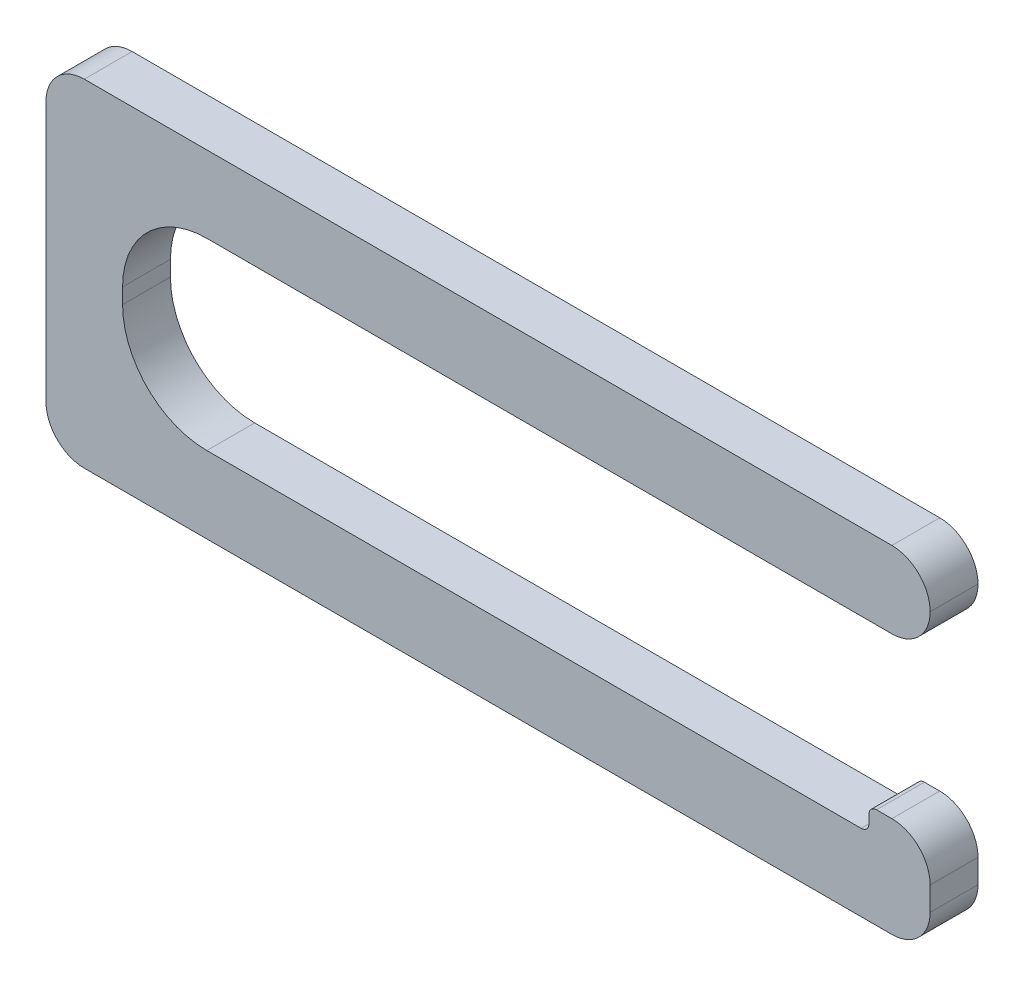
ISO-10303-21;
HEADER;
FILE_DESCRIPTION(('STEP AP214'),'2;1');
FILE_NAME('part.step','',(''),(''),'','','');
FILE_SCHEMA(('AUTOMOTIVE_DESIGN { 1 0 10303 214 1 1 1 1 }'));
ENDSEC;
DATA;
#1=APPLICATION_CONTEXT('core data for automotive mechanical design processes');
#2=APPLICATION_PROTOCOL_DEFINITION('international standard','automotive_design',2000,#1);
#3=PRODUCT_CONTEXT('',#1,'mechanical');
#4=PRODUCT('Part','Part','',(#3));
#5=PRODUCT_RELATED_PRODUCT_CATEGORY('part','',(#4));
#6=PRODUCT_DEFINITION_FORMATION('','',#4);
#7=PRODUCT_DEFINITION_CONTEXT('part definition',#1,'design');
#8=PRODUCT_DEFINITION('design','',#6,#7);
#9=PRODUCT_DEFINITION_SHAPE('','',#8);
#10=(LENGTH_UNIT() NAMED_UNIT(*) SI_UNIT(.MILLI.,.METRE.));
#11=(NAMED_UNIT(*) PLANE_ANGLE_UNIT() SI_UNIT($,.RADIAN.));
#12=(NAMED_UNIT(*) SI_UNIT($,.STERADIAN.) SOLID_ANGLE_UNIT());
#13=UNCERTAINTY_MEASURE_WITH_UNIT(LENGTH_MEASURE(1.E-05),#10,'distance_accuracy_value','');
#14=(GEOMETRIC_REPRESENTATION_CONTEXT(3) GLOBAL_UNCERTAINTY_ASSIGNED_CONTEXT((#13)) GLOBAL_UNIT_ASSIGNED_CONTEXT((#10,
#11,#12)) REPRESENTATION_CONTEXT('',''));
#15=CARTESIAN_POINT('',(0.,0.,0.));
#16=DIRECTION('',(0.,0.,1.));
#17=DIRECTION('',(1.,0.,0.));
#18=AXIS2_PLACEMENT_3D('',#15,#16,#17);
#19=CARTESIAN_POINT('',(5.65188625765606,14.0245622090613,1.5875));
#20=DIRECTION('',(1.,0.,0.));
#21=DIRECTION('',(0.,1.,0.));
#22=AXIS2_PLACEMENT_3D('',#19,#20,#21);
#23=PLANE('',#22);
#24=DIRECTION('',(0.,-1.,0.));
#25=VECTOR('',#24,1.);
#26=CARTESIAN_POINT('',(5.65188625765606,14.0245622090613,0.));
#27=LINE('',#26,#25);
#28=CARTESIAN_POINT('',(5.65188625765606,12.7545622090613,0.));
#29=VERTEX_POINT('',#28);
#30=CARTESIAN_POINT('',(5.65188625765606,4.11856220906129,0.));
#31=VERTEX_POINT('',#30);
#32=EDGE_CURVE('E191',#29,#31,#27,.T.);
#33=ORIENTED_EDGE('',*,*,#32,.T.);
#34=DIRECTION('',(0.,0.,-1.));
#35=VECTOR('',#34,1.);
#36=CARTESIAN_POINT('',(5.65188625765606,4.11856220906129,1.5875));
#37=LINE('',#36,#35);
#38=CARTESIAN_POINT('',(5.65188625765606,4.11856220906129,1.5875));
#39=VERTEX_POINT('',#38);
#40=EDGE_CURVE('E168',#31,#39,#37,.F.);
#41=ORIENTED_EDGE('',*,*,#40,.T.);
#42=DIRECTION('',(0.,-1.,0.));
#43=VECTOR('',#42,1.);
#44=CARTESIAN_POINT('',(5.65188625765606,14.0245622090613,1.5875));
#45=LINE('',#44,#43);
#46=CARTESIAN_POINT('',(5.65188625765606,12.7545622090613,1.5875));
#47=VERTEX_POINT('',#46);
#48=EDGE_CURVE('E216',#47,#39,#45,.T.);
#49=ORIENTED_EDGE('',*,*,#48,.F.);
#50=DIRECTION('',(0.,0.,-1.));
#51=VECTOR('',#50,1.);
#52=CARTESIAN_POINT('',(5.65188625765606,12.7545622090613,1.5875));
#53=LINE('',#52,#51);
#54=EDGE_CURVE('E173',#47,#29,#53,.T.);
#55=ORIENTED_EDGE('',*,*,#54,.T.);
#56=EDGE_LOOP('',(#33,#41,#49,#55));
#57=FACE_BOUND('',#56,.T.);
#58=ADVANCED_FACE('F33',(#57),#23,.F.);
#59=CARTESIAN_POINT('',(5.65188625765606,2.84856220906129,1.5875));
#60=DIRECTION('',(0.,1.,0.));
#61=DIRECTION('',(0.,0.,1.));
#62=AXIS2_PLACEMENT_3D('',#59,#60,#61);
#63=PLANE('',#62);
#64=DIRECTION('',(1.,0.,0.));
#65=VECTOR('',#64,1.);
#66=CARTESIAN_POINT('',(5.65188625765606,2.84856220906129,1.5875));
#67=LINE('',#66,#65);
#68=CARTESIAN_POINT('',(6.92188625765606,2.84856220906129,1.5875));
#69=VERTEX_POINT('',#68);
#70=CARTESIAN_POINT('',(33.7091862576561,2.84856220906129,1.5875));
#71=VERTEX_POINT('',#70);
#72=EDGE_CURVE('E183',#69,#71,#67,.T.);
#73=ORIENTED_EDGE('',*,*,#72,.F.);
#74=DIRECTION('',(0.,0.,-1.));
#75=VECTOR('',#74,1.);
#76=CARTESIAN_POINT('',(6.92188625765606,2.84856220906129,1.5875));
#77=LINE('',#76,#75);
#78=CARTESIAN_POINT('',(6.92188625765606,2.84856220906129,0.));
#79=VERTEX_POINT('',#78);
#80=EDGE_CURVE('E167',#69,#79,#77,.T.);
#81=ORIENTED_EDGE('',*,*,#80,.T.);
#82=DIRECTION('',(1.,0.,0.));
#83=VECTOR('',#82,1.);
#84=CARTESIAN_POINT('',(5.65188625765606,2.84856220906129,0.));
#85=LINE('',#84,#83);
#86=CARTESIAN_POINT('',(33.7091862576561,2.84856220906129,0.));
#87=VERTEX_POINT('',#86);
#88=EDGE_CURVE('E180',#79,#87,#85,.T.);
#89=ORIENTED_EDGE('',*,*,#88,.T.);
#90=DIRECTION('',(0.,0.,-1.));
#91=VECTOR('',#90,1.);
#92=CARTESIAN_POINT('',(33.7091862576561,2.84856220906129,1.5875));
#93=LINE('',#92,#91);
#94=EDGE_CURVE('E185',#87,#71,#93,.F.);
#95=ORIENTED_EDGE('',*,*,#94,.T.);
#96=EDGE_LOOP('',(#73,#81,#89,#95));
#97=FACE_BOUND('',#96,.T.);
#98=ADVANCED_FACE('F179',(#97),#63,.F.);
#99=CARTESIAN_POINT('',(34.9791862576561,2.84856220906129,1.5875));
#100=DIRECTION('',(-1.,0.,0.));
#101=DIRECTION('',(0.,0.,1.));
#102=AXIS2_PLACEMENT_3D('',#99,#100,#101);
#103=PLANE('',#102);
#104=DIRECTION('',(0.,1.,0.));
#105=VECTOR('',#104,1.);
#106=CARTESIAN_POINT('',(34.9791862576561,2.84856220906129,1.5875));
#107=LINE('',#106,#105);
#108=CARTESIAN_POINT('',(34.9791862576561,4.11856220906129,1.5875));
#109=VERTEX_POINT('',#108);
#110=CARTESIAN_POINT('',(34.9791862576561,4.90596220906129,1.5875));
#111=VERTEX_POINT('',#110);
#112=EDGE_CURVE('E315',#109,#111,#107,.T.);
#113=ORIENTED_EDGE('',*,*,#112,.F.);
#114=DIRECTION('',(0.,0.,-1.));
#115=VECTOR('',#114,1.);
#116=CARTESIAN_POINT('',(34.9791862576561,4.11856220906129,1.5875));
#117=LINE('',#116,#115);
#118=CARTESIAN_POINT('',(34.9791862576561,4.11856220906129,0.));
#119=VERTEX_POINT('',#118);
#120=EDGE_CURVE('E245',#109,#119,#117,.T.);
#121=ORIENTED_EDGE('',*,*,#120,.T.);
#122=DIRECTION('',(0.,1.,0.));
#123=VECTOR('',#122,1.);
#124=CARTESIAN_POINT('',(34.9791862576561,2.84856220906129,0.));
#125=LINE('',#124,#123);
#126=CARTESIAN_POINT('',(34.9791862576561,4.90596220906129,0.));
#127=VERTEX_POINT('',#126);
#128=EDGE_CURVE('E190',#119,#127,#125,.T.);
#129=ORIENTED_EDGE('',*,*,#128,.T.);
#130=DIRECTION('',(0.,0.,-1.));
#131=VECTOR('',#130,1.);
#132=CARTESIAN_POINT('',(34.9791862576561,4.90596220906129,1.5875));
#133=LINE('',#132,#131);
#134=EDGE_CURVE('E243',#127,#111,#133,.F.);
#135=ORIENTED_EDGE('',*,*,#134,.T.);
#136=EDGE_LOOP('',(#113,#121,#129,#135));
#137=FACE_BOUND('',#136,.T.);
#138=ADVANCED_FACE('F358',(#137),#103,.F.);
#139=CARTESIAN_POINT('',(32.947186257656,6.17596220906129,1.5875));
#140=DIRECTION('',(0.,-1.,0.));
#141=DIRECTION('',(0.,0.,-1.));
#142=AXIS2_PLACEMENT_3D('',#139,#140,#141);
#143=PLANE('',#142);
#144=DIRECTION('',(-1.,0.,0.));
#145=VECTOR('',#144,1.);
#146=CARTESIAN_POINT('',(32.947186257656,6.17596220906129,0.));
#147=LINE('',#146,#145);
#148=CARTESIAN_POINT('',(33.7091862576561,6.17596220906129,0.));
#149=VERTEX_POINT('',#148);
#150=CARTESIAN_POINT('',(33.201186257656,6.17596220906129,0.));
#151=VERTEX_POINT('',#150);
#152=EDGE_CURVE('E194',#149,#151,#147,.T.);
#153=ORIENTED_EDGE('',*,*,#152,.T.);
#154=DIRECTION('',(0.,0.,-1.));
#155=VECTOR('',#154,1.);
#156=CARTESIAN_POINT('',(33.201186257656,6.17596220906129,1.5875));
#157=LINE('',#156,#155);
#158=CARTESIAN_POINT('',(33.201186257656,6.17596220906129,1.5875));
#159=VERTEX_POINT('',#158);
#160=EDGE_CURVE('E270',#151,#159,#157,.F.);
#161=ORIENTED_EDGE('',*,*,#160,.T.);
#162=DIRECTION('',(-1.,0.,0.));
#163=VECTOR('',#162,1.);
#164=CARTESIAN_POINT('',(32.947186257656,6.17596220906129,1.5875));
#165=LINE('',#164,#163);
#166=CARTESIAN_POINT('',(33.7091862576561,6.17596220906129,1.5875));
#167=VERTEX_POINT('',#166);
#168=EDGE_CURVE('E312',#167,#159,#165,.T.);
#169=ORIENTED_EDGE('',*,*,#168,.F.);
#170=DIRECTION('',(0.,0.,-1.));
#171=VECTOR('',#170,1.);
#172=CARTESIAN_POINT('',(33.7091862576561,6.17596220906129,1.5875));
#173=LINE('',#172,#171);
#174=EDGE_CURVE('E248',#167,#149,#173,.T.);
#175=ORIENTED_EDGE('',*,*,#174,.T.);
#176=EDGE_LOOP('',(#153,#161,#169,#175));
#177=FACE_BOUND('',#176,.T.);
#178=ADVANCED_FACE('F390',(#177),#143,.F.);
#179=CARTESIAN_POINT('',(32.947186257656,5.38856220906129,1.5875));
#180=DIRECTION('',(1.,0.,0.));
#181=DIRECTION('',(0.,0.,-1.));
#182=AXIS2_PLACEMENT_3D('',#179,#180,#181);
#183=PLANE('',#182);
#184=DIRECTION('',(0.,-1.,0.));
#185=VECTOR('',#184,1.);
#186=CARTESIAN_POINT('',(32.947186257656,5.38856220906129,0.));
#187=LINE('',#186,#185);
#188=CARTESIAN_POINT('',(32.947186257656,5.92196220906129,0.));
#189=VERTEX_POINT('',#188);
#190=CARTESIAN_POINT('',(32.947186257656,5.64256220906129,0.));
#191=VERTEX_POINT('',#190);
#192=EDGE_CURVE('E202',#189,#191,#187,.T.);
#193=ORIENTED_EDGE('',*,*,#192,.T.);
#194=DIRECTION('',(0.,0.,-1.));
#195=VECTOR('',#194,1.);
#196=CARTESIAN_POINT('',(32.947186257656,5.64256220906129,1.5875));
#197=LINE('',#196,#195);
#198=CARTESIAN_POINT('',(32.947186257656,5.64256220906129,1.5875));
#199=VERTEX_POINT('',#198);
#200=EDGE_CURVE('E266',#191,#199,#197,.F.);
#201=ORIENTED_EDGE('',*,*,#200,.T.);
#202=DIRECTION('',(0.,-1.,0.));
#203=VECTOR('',#202,1.);
#204=CARTESIAN_POINT('',(32.947186257656,5.38856220906129,1.5875));
#205=LINE('',#204,#203);
#206=CARTESIAN_POINT('',(32.947186257656,5.92196220906129,1.5875));
#207=VERTEX_POINT('',#206);
#208=EDGE_CURVE('E309',#207,#199,#205,.T.);
#209=ORIENTED_EDGE('',*,*,#208,.F.);
#210=DIRECTION('',(0.,0.,-1.));
#211=VECTOR('',#210,1.);
#212=CARTESIAN_POINT('',(32.947186257656,5.92196220906129,1.5875));
#213=LINE('',#212,#211);
#214=EDGE_CURVE('E263',#207,#189,#213,.T.);
#215=ORIENTED_EDGE('',*,*,#214,.T.);
#216=EDGE_LOOP('',(#193,#201,#209,#215));
#217=FACE_BOUND('',#216,.T.);
#218=ADVANCED_FACE('F395',(#217),#183,.F.);
#219=CARTESIAN_POINT('',(32.947186257656,5.38856220906129,1.5875));
#220=DIRECTION('',(0.,-1.,0.));
#221=DIRECTION('',(1.,0.,0.));
#222=AXIS2_PLACEMENT_3D('',#219,#220,#221);
#223=PLANE('',#222);
#224=DIRECTION('',(-1.,0.,0.));
#225=VECTOR('',#224,1.);
#226=CARTESIAN_POINT('',(32.947186257656,5.38856220906129,0.));
#227=LINE('',#226,#225);
#228=CARTESIAN_POINT('',(32.6931862576561,5.38856220906129,0.));
#229=VERTEX_POINT('',#228);
#230=CARTESIAN_POINT('',(10.9858862576561,5.38856220906129,0.));
#231=VERTEX_POINT('',#230);
#232=EDGE_CURVE('E205',#229,#231,#227,.T.);
#233=ORIENTED_EDGE('',*,*,#232,.T.);
#234=DIRECTION('',(0.,0.,-1.));
#235=VECTOR('',#234,1.);
#236=CARTESIAN_POINT('',(10.9858862576561,5.38856220906129,1.5875));
#237=LINE('',#236,#235);
#238=CARTESIAN_POINT('',(10.9858862576561,5.38856220906129,1.5875));
#239=VERTEX_POINT('',#238);
#240=EDGE_CURVE('E283',#231,#239,#237,.F.);
#241=ORIENTED_EDGE('',*,*,#240,.T.);
#242=DIRECTION('',(-1.,0.,0.));
#243=VECTOR('',#242,1.);
#244=CARTESIAN_POINT('',(32.947186257656,5.38856220906129,1.5875));
#245=LINE('',#244,#243);
#246=CARTESIAN_POINT('',(32.6931862576561,5.38856220906129,1.5875));
#247=VERTEX_POINT('',#246);
#248=EDGE_CURVE('E304',#247,#239,#245,.T.);
#249=ORIENTED_EDGE('',*,*,#248,.F.);
#250=DIRECTION('',(0.,0.,-1.));
#251=VECTOR('',#250,1.);
#252=CARTESIAN_POINT('',(32.6931862576561,5.38856220906129,0.));
#253=LINE('',#252,#251);
#254=EDGE_CURVE('E258',#247,#229,#253,.T.);
#255=ORIENTED_EDGE('',*,*,#254,.T.);
#256=EDGE_LOOP('',(#233,#241,#249,#255));
#257=FACE_BOUND('',#256,.T.);
#258=ADVANCED_FACE('F407',(#257),#223,.F.);
#259=CARTESIAN_POINT('',(8.19188625765606,5.38856220906129,1.5875));
#260=DIRECTION('',(-1.,0.,0.));
#261=DIRECTION('',(0.,0.,1.));
#262=AXIS2_PLACEMENT_3D('',#259,#260,#261);
#263=PLANE('',#262);
#264=DIRECTION('',(0.,1.,0.));
#265=VECTOR('',#264,1.);
#266=CARTESIAN_POINT('',(8.19188625765606,5.38856220906129,1.5875));
#267=LINE('',#266,#265);
#268=CARTESIAN_POINT('',(8.19188625765606,8.18256220906129,1.5875));
#269=VERTEX_POINT('',#268);
#270=CARTESIAN_POINT('',(8.19188625765606,8.69056220906129,1.5875));
#271=VERTEX_POINT('',#270);
#272=EDGE_CURVE('E301',#269,#271,#267,.T.);
#273=ORIENTED_EDGE('',*,*,#272,.F.);
#274=DIRECTION('',(0.,0.,-1.));
#275=VECTOR('',#274,1.);
#276=CARTESIAN_POINT('',(8.19188625765606,8.18256220906129,0.));
#277=LINE('',#276,#275);
#278=CARTESIAN_POINT('',(8.19188625765606,8.18256220906129,0.));
#279=VERTEX_POINT('',#278);
#280=EDGE_CURVE('E280',#269,#279,#277,.T.);
#281=ORIENTED_EDGE('',*,*,#280,.T.);
#282=DIRECTION('',(0.,1.,0.));
#283=VECTOR('',#282,1.);
#284=CARTESIAN_POINT('',(8.19188625765606,5.38856220906129,0.));
#285=LINE('',#284,#283);
#286=CARTESIAN_POINT('',(8.19188625765606,8.69056220906129,0.));
#287=VERTEX_POINT('',#286);
#288=EDGE_CURVE('E208',#279,#287,#285,.T.);
#289=ORIENTED_EDGE('',*,*,#288,.T.);
#290=DIRECTION('',(0.,0.,-1.));
#291=VECTOR('',#290,1.);
#292=CARTESIAN_POINT('',(8.19188625765606,8.69056220906129,1.5875));
#293=LINE('',#292,#291);
#294=EDGE_CURVE('E278',#287,#271,#293,.F.);
#295=ORIENTED_EDGE('',*,*,#294,.T.);
#296=EDGE_LOOP('',(#273,#281,#289,#295));
#297=FACE_BOUND('',#296,.T.);
#298=ADVANCED_FACE('F294',(#297),#263,.F.);
#299=CARTESIAN_POINT('',(8.19188625765606,11.4845622090613,1.5875));
#300=DIRECTION('',(0.,1.,0.));
#301=DIRECTION('',(0.,0.,1.));
#302=AXIS2_PLACEMENT_3D('',#299,#300,#301);
#303=PLANE('',#302);
#304=DIRECTION('',(1.,0.,0.));
#305=VECTOR('',#304,1.);
#306=CARTESIAN_POINT('',(8.19188625765606,11.4845622090613,1.5875));
#307=LINE('',#306,#305);
#308=CARTESIAN_POINT('',(10.9858862576561,11.4845622090613,1.5875));
#309=VERTEX_POINT('',#308);
#310=CARTESIAN_POINT('',(33.7091862576561,11.4845622090613,1.5875));
#311=VERTEX_POINT('',#310);
#312=EDGE_CURVE('E298',#309,#311,#307,.T.);
#313=ORIENTED_EDGE('',*,*,#312,.F.);
#314=DIRECTION('',(0.,0.,-1.));
#315=VECTOR('',#314,1.);
#316=CARTESIAN_POINT('',(10.9858862576561,11.4845622090613,0.));
#317=LINE('',#316,#315);
#318=CARTESIAN_POINT('',(10.9858862576561,11.4845622090613,0.));
#319=VERTEX_POINT('',#318);
#320=EDGE_CURVE('E285',#309,#319,#317,.T.);
#321=ORIENTED_EDGE('',*,*,#320,.T.);
#322=DIRECTION('',(1.,0.,0.));
#323=VECTOR('',#322,1.);
#324=CARTESIAN_POINT('',(8.19188625765606,11.4845622090613,0.));
#325=LINE('',#324,#323);
#326=CARTESIAN_POINT('',(33.7091862576561,11.4845622090613,0.));
#327=VERTEX_POINT('',#326);
#328=EDGE_CURVE('E211',#319,#327,#325,.T.);
#329=ORIENTED_EDGE('',*,*,#328,.T.);
#330=DIRECTION('',(0.,0.,-1.));
#331=VECTOR('',#330,1.);
#332=CARTESIAN_POINT('',(33.7091862576561,11.4845622090613,1.5875));
#333=LINE('',#332,#331);
#334=EDGE_CURVE('E255',#327,#311,#333,.F.);
#335=ORIENTED_EDGE('',*,*,#334,.T.);
#336=EDGE_LOOP('',(#313,#321,#329,#335));
#337=FACE_BOUND('',#336,.T.);
#338=ADVANCED_FACE('F297',(#337),#303,.F.);
#339=CARTESIAN_POINT('',(34.9791862576561,14.0245622090613,1.5875));
#340=DIRECTION('',(0.,-1.,0.));
#341=DIRECTION('',(1.,0.,0.));
#342=AXIS2_PLACEMENT_3D('',#339,#340,#341);
#343=PLANE('',#342);
#344=DIRECTION('',(-1.,0.,0.));
#345=VECTOR('',#344,1.);
#346=CARTESIAN_POINT('',(34.9791862576561,14.0245622090613,0.));
#347=LINE('',#346,#345);
#348=CARTESIAN_POINT('',(33.7091862576561,14.0245622090613,0.));
#349=VERTEX_POINT('',#348);
#350=CARTESIAN_POINT('',(6.92188625765606,14.0245622090613,0.));
#351=VERTEX_POINT('',#350);
#352=EDGE_CURVE('E213',#349,#351,#347,.T.);
#353=ORIENTED_EDGE('',*,*,#352,.T.);
#354=DIRECTION('',(0.,0.,-1.));
#355=VECTOR('',#354,1.);
#356=CARTESIAN_POINT('',(6.92188625765606,14.0245622090613,1.5875));
#357=LINE('',#356,#355);
#358=CARTESIAN_POINT('',(6.92188625765606,14.0245622090613,1.5875));
#359=VERTEX_POINT('',#358);
#360=EDGE_CURVE('E253',#351,#359,#357,.F.);
#361=ORIENTED_EDGE('',*,*,#360,.T.);
#362=DIRECTION('',(-1.,0.,0.));
#363=VECTOR('',#362,1.);
#364=CARTESIAN_POINT('',(34.9791862576561,14.0245622090613,1.5875));
#365=LINE('',#364,#363);
#366=CARTESIAN_POINT('',(33.7091862576561,14.0245622090613,1.5875));
#367=VERTEX_POINT('',#366);
#368=EDGE_CURVE('E217',#367,#359,#365,.T.);
#369=ORIENTED_EDGE('',*,*,#368,.F.);
#370=DIRECTION('',(0.,0.,-1.));
#371=VECTOR('',#370,1.);
#372=CARTESIAN_POINT('',(33.7091862576561,14.0245622090613,1.5875));
#373=LINE('',#372,#371);
#374=EDGE_CURVE('E251',#367,#349,#373,.T.);
#375=ORIENTED_EDGE('',*,*,#374,.T.);
#376=EDGE_LOOP('',(#353,#361,#369,#375));
#377=FACE_BOUND('',#376,.T.);
#378=ADVANCED_FACE('F331',(#377),#343,.F.);
#379=CARTESIAN_POINT('',(0.,0.,1.5875));
#380=DIRECTION('',(0.,0.,1.));
#381=DIRECTION('',(1.,0.,0.));
#382=AXIS2_PLACEMENT_3D('',#379,#380,#381);
#383=PLANE('',#382);
#384=ORIENTED_EDGE('',*,*,#168,.T.);
#385=CARTESIAN_POINT('',(33.201186257656,5.92196220906129,1.5875));
#386=DIRECTION('',(0.,0.,1.));
#387=DIRECTION('',(1.,0.,0.));
#388=AXIS2_PLACEMENT_3D('',#385,#386,#387);
#389=CIRCLE('',#388,0.254);
#390=EDGE_CURVE('E272',#159,#207,#389,.T.);
#391=ORIENTED_EDGE('',*,*,#390,.T.);
#392=ORIENTED_EDGE('',*,*,#208,.T.);
#393=CARTESIAN_POINT('',(32.6931862576561,5.64256220906129,1.5875));
#394=DIRECTION('',(0.,0.,1.));
#395=DIRECTION('',(1.,0.,0.));
#396=AXIS2_PLACEMENT_3D('',#393,#394,#395);
#397=CIRCLE('',#396,0.254);
#398=EDGE_CURVE('E276',#199,#247,#397,.F.);
#399=ORIENTED_EDGE('',*,*,#398,.T.);
#400=ORIENTED_EDGE('',*,*,#248,.T.);
#401=CARTESIAN_POINT('',(10.9858862576561,8.18256220906129,1.5875));
#402=DIRECTION('',(0.,0.,1.));
#403=DIRECTION('',(1.,0.,0.));
#404=AXIS2_PLACEMENT_3D('',#401,#402,#403);
#405=CIRCLE('',#404,2.794);
#406=EDGE_CURVE('E289',#239,#269,#405,.F.);
#407=ORIENTED_EDGE('',*,*,#406,.T.);
#408=ORIENTED_EDGE('',*,*,#272,.T.);
#409=CARTESIAN_POINT('',(10.9858862576561,8.69056220906129,1.5875));
#410=DIRECTION('',(0.,0.,1.));
#411=DIRECTION('',(1.,0.,0.));
#412=AXIS2_PLACEMENT_3D('',#409,#410,#411);
#413=CIRCLE('',#412,2.794);
#414=EDGE_CURVE('E11',#271,#309,#413,.F.);
#415=ORIENTED_EDGE('',*,*,#414,.T.);
#416=ORIENTED_EDGE('',*,*,#312,.T.);
#417=CARTESIAN_POINT('',(33.7091862576561,12.7545622090613,1.5875));
#418=DIRECTION('',(0.,0.,1.));
#419=DIRECTION('',(1.,0.,0.));
#420=AXIS2_PLACEMENT_3D('',#417,#418,#419);
#421=CIRCLE('',#420,1.27);
#422=CARTESIAN_POINT('',(34.9791862576561,12.7545622090613,1.5875));
#423=VERTEX_POINT('',#422);
#424=EDGE_CURVE('E233',#311,#423,#421,.T.);
#425=ORIENTED_EDGE('',*,*,#424,.T.);
#426=CARTESIAN_POINT('',(33.7091862576561,12.7545622090613,1.5875));
#427=DIRECTION('',(0.,0.,1.));
#428=DIRECTION('',(1.,0.,0.));
#429=AXIS2_PLACEMENT_3D('',#426,#427,#428);
#430=CIRCLE('',#429,1.27);
#431=EDGE_CURVE('E231',#423,#367,#430,.T.);
#432=ORIENTED_EDGE('',*,*,#431,.T.);
#433=ORIENTED_EDGE('',*,*,#368,.T.);
#434=CARTESIAN_POINT('',(6.92188625765606,12.7545622090613,1.5875));
#435=DIRECTION('',(0.,0.,1.));
#436=DIRECTION('',(1.,0.,0.));
#437=AXIS2_PLACEMENT_3D('',#434,#435,#436);
#438=CIRCLE('',#437,1.27);
#439=EDGE_CURVE('E235',#359,#47,#438,.T.);
#440=ORIENTED_EDGE('',*,*,#439,.T.);
#441=ORIENTED_EDGE('',*,*,#48,.T.);
#442=CARTESIAN_POINT('',(6.92188625765606,4.11856220906129,1.5875));
#443=DIRECTION('',(0.,0.,1.));
#444=DIRECTION('',(1.,0.,0.));
#445=AXIS2_PLACEMENT_3D('',#442,#443,#444);
#446=CIRCLE('',#445,1.27);
#447=EDGE_CURVE('E241',#39,#69,#446,.T.);
#448=ORIENTED_EDGE('',*,*,#447,.T.);
#449=ORIENTED_EDGE('',*,*,#72,.T.);
#450=CARTESIAN_POINT('',(33.7091862576561,4.11856220906129,1.5875));
#451=DIRECTION('',(0.,0.,1.));
#452=DIRECTION('',(1.,0.,0.));
#453=AXIS2_PLACEMENT_3D('',#450,#451,#452);
#454=CIRCLE('',#453,1.27);
#455=EDGE_CURVE('E239',#71,#109,#454,.T.);
#456=ORIENTED_EDGE('',*,*,#455,.T.);
#457=ORIENTED_EDGE('',*,*,#112,.T.);
#458=CARTESIAN_POINT('',(33.7091862576561,4.90596220906129,1.5875));
#459=DIRECTION('',(0.,0.,1.));
#460=DIRECTION('',(1.,0.,0.));
#461=AXIS2_PLACEMENT_3D('',#458,#459,#460);
#462=CIRCLE('',#461,1.27);
#463=EDGE_CURVE('E237',#111,#167,#462,.T.);
#464=ORIENTED_EDGE('',*,*,#463,.T.);
#465=EDGE_LOOP('',(#384,#391,#392,#399,#400,#407,#408,#415,#416,#425,#432,#433,#440,#441,#448,
#449,#456,#457,#464));
#466=FACE_BOUND('',#465,.T.);
#467=ADVANCED_FACE('F321',(#466),#383,.T.);
#468=CARTESIAN_POINT('',(0.,0.,0.));
#469=DIRECTION('',(0.,0.,1.));
#470=DIRECTION('',(1.,0.,0.));
#471=AXIS2_PLACEMENT_3D('',#468,#469,#470);
#472=PLANE('',#471);
#473=ORIENTED_EDGE('',*,*,#192,.F.);
#474=CARTESIAN_POINT('',(33.201186257656,5.92196220906129,0.));
#475=DIRECTION('',(0.,0.,1.));
#476=DIRECTION('',(1.,0.,0.));
#477=AXIS2_PLACEMENT_3D('',#474,#475,#476);
#478=CIRCLE('',#477,0.254);
#479=EDGE_CURVE('E268',#189,#151,#478,.F.);
#480=ORIENTED_EDGE('',*,*,#479,.T.);
#481=ORIENTED_EDGE('',*,*,#152,.F.);
#482=CARTESIAN_POINT('',(33.7091862576561,4.90596220906129,0.));
#483=DIRECTION('',(0.,0.,1.));
#484=DIRECTION('',(1.,0.,0.));
#485=AXIS2_PLACEMENT_3D('',#482,#483,#484);
#486=CIRCLE('',#485,1.27);
#487=EDGE_CURVE('E225',#149,#127,#486,.F.);
#488=ORIENTED_EDGE('',*,*,#487,.T.);
#489=ORIENTED_EDGE('',*,*,#128,.F.);
#490=CARTESIAN_POINT('',(33.7091862576561,4.11856220906129,0.));
#491=DIRECTION('',(0.,0.,1.));
#492=DIRECTION('',(1.,0.,0.));
#493=AXIS2_PLACEMENT_3D('',#490,#491,#492);
#494=CIRCLE('',#493,1.27);
#495=EDGE_CURVE('E174',#119,#87,#494,.F.);
#496=ORIENTED_EDGE('',*,*,#495,.T.);
#497=ORIENTED_EDGE('',*,*,#88,.F.);
#498=CARTESIAN_POINT('',(6.92188625765606,4.11856220906129,0.));
#499=DIRECTION('',(0.,0.,1.));
#500=DIRECTION('',(1.,0.,0.));
#501=AXIS2_PLACEMENT_3D('',#498,#499,#500);
#502=CIRCLE('',#501,1.27);
#503=EDGE_CURVE('E163',#79,#31,#502,.F.);
#504=ORIENTED_EDGE('',*,*,#503,.T.);
#505=ORIENTED_EDGE('',*,*,#32,.F.);
#506=CARTESIAN_POINT('',(6.92188625765606,12.7545622090613,0.));
#507=DIRECTION('',(0.,0.,1.));
#508=DIRECTION('',(1.,0.,0.));
#509=AXIS2_PLACEMENT_3D('',#506,#507,#508);
#510=CIRCLE('',#509,1.27);
#511=EDGE_CURVE('E223',#29,#351,#510,.F.);
#512=ORIENTED_EDGE('',*,*,#511,.T.);
#513=ORIENTED_EDGE('',*,*,#352,.F.);
#514=CARTESIAN_POINT('',(33.7091862576561,12.7545622090613,0.));
#515=DIRECTION('',(0.,0.,1.));
#516=DIRECTION('',(1.,0.,0.));
#517=AXIS2_PLACEMENT_3D('',#514,#515,#516);
#518=CIRCLE('',#517,1.27);
#519=CARTESIAN_POINT('',(34.9791862576561,12.7545622090613,0.));
#520=VERTEX_POINT('',#519);
#521=EDGE_CURVE('E184',#349,#520,#518,.F.);
#522=ORIENTED_EDGE('',*,*,#521,.T.);
#523=CARTESIAN_POINT('',(33.7091862576561,12.7545622090613,0.));
#524=DIRECTION('',(0.,0.,1.));
#525=DIRECTION('',(1.,0.,0.));
#526=AXIS2_PLACEMENT_3D('',#523,#524,#525);
#527=CIRCLE('',#526,1.27);
#528=EDGE_CURVE('E220',#520,#327,#527,.F.);
#529=ORIENTED_EDGE('',*,*,#528,.T.);
#530=ORIENTED_EDGE('',*,*,#328,.F.);
#531=CARTESIAN_POINT('',(10.9858862576561,8.69056220906129,0.));
#532=DIRECTION('',(0.,0.,1.));
#533=DIRECTION('',(1.,0.,0.));
#534=AXIS2_PLACEMENT_3D('',#531,#532,#533);
#535=CIRCLE('',#534,2.794);
#536=EDGE_CURVE('E41',#319,#287,#535,.T.);
#537=ORIENTED_EDGE('',*,*,#536,.T.);
#538=ORIENTED_EDGE('',*,*,#288,.F.);
#539=CARTESIAN_POINT('',(10.9858862576561,8.18256220906129,0.));
#540=DIRECTION('',(0.,0.,1.));
#541=DIRECTION('',(1.,0.,0.));
#542=AXIS2_PLACEMENT_3D('',#539,#540,#541);
#543=CIRCLE('',#542,2.794);
#544=EDGE_CURVE('E287',#279,#231,#543,.T.);
#545=ORIENTED_EDGE('',*,*,#544,.T.);
#546=ORIENTED_EDGE('',*,*,#232,.F.);
#547=CARTESIAN_POINT('',(32.6931862576561,5.64256220906129,0.));
#548=DIRECTION('',(0.,0.,1.));
#549=DIRECTION('',(1.,0.,0.));
#550=AXIS2_PLACEMENT_3D('',#547,#548,#549);
#551=CIRCLE('',#550,0.254);
#552=EDGE_CURVE('E274',#229,#191,#551,.T.);
#553=ORIENTED_EDGE('',*,*,#552,.T.);
#554=EDGE_LOOP('',(#473,#480,#481,#488,#489,#496,#497,#504,#505,#512,#513,#522,#529,#530,#537,
#538,#545,#546,#553));
#555=FACE_BOUND('',#554,.T.);
#556=ADVANCED_FACE('F188',(#555),#472,.F.);
#557=CARTESIAN_POINT('',(6.92188625765606,4.11856220906129,1.5875));
#558=DIRECTION('',(0.,0.,-1.));
#559=DIRECTION('',(-1.,0.,0.));
#560=AXIS2_PLACEMENT_3D('',#557,#558,#559);
#561=CYLINDRICAL_SURFACE('',#560,1.27);
#562=ORIENTED_EDGE('',*,*,#447,.F.);
#563=ORIENTED_EDGE('',*,*,#40,.F.);
#564=ORIENTED_EDGE('',*,*,#503,.F.);
#565=ORIENTED_EDGE('',*,*,#80,.F.);
#566=EDGE_LOOP('',(#562,#563,#564,#565));
#567=FACE_BOUND('',#566,.T.);
#568=ADVANCED_FACE('F166',(#567),#561,.T.);
#569=CARTESIAN_POINT('',(33.7091862576561,4.11856220906129,1.5875));
#570=DIRECTION('',(0.,0.,-1.));
#571=DIRECTION('',(-1.,0.,0.));
#572=AXIS2_PLACEMENT_3D('',#569,#570,#571);
#573=CYLINDRICAL_SURFACE('',#572,1.27);
#574=ORIENTED_EDGE('',*,*,#455,.F.);
#575=ORIENTED_EDGE('',*,*,#94,.F.);
#576=ORIENTED_EDGE('',*,*,#495,.F.);
#577=ORIENTED_EDGE('',*,*,#120,.F.);
#578=EDGE_LOOP('',(#574,#575,#576,#577));
#579=FACE_BOUND('',#578,.T.);
#580=ADVANCED_FACE('F364',(#579),#573,.T.);
#581=CARTESIAN_POINT('',(33.7091862576561,4.90596220906129,1.5875));
#582=DIRECTION('',(0.,0.,-1.));
#583=DIRECTION('',(-1.,0.,0.));
#584=AXIS2_PLACEMENT_3D('',#581,#582,#583);
#585=CYLINDRICAL_SURFACE('',#584,1.27);
#586=ORIENTED_EDGE('',*,*,#463,.F.);
#587=ORIENTED_EDGE('',*,*,#134,.F.);
#588=ORIENTED_EDGE('',*,*,#487,.F.);
#589=ORIENTED_EDGE('',*,*,#174,.F.);
#590=EDGE_LOOP('',(#586,#587,#588,#589));
#591=FACE_BOUND('',#590,.T.);
#592=ADVANCED_FACE('F367',(#591),#585,.T.);
#593=CARTESIAN_POINT('',(6.92188625765606,12.7545622090613,1.5875));
#594=DIRECTION('',(0.,0.,-1.));
#595=DIRECTION('',(-1.,0.,0.));
#596=AXIS2_PLACEMENT_3D('',#593,#594,#595);
#597=CYLINDRICAL_SURFACE('',#596,1.27);
#598=ORIENTED_EDGE('',*,*,#439,.F.);
#599=ORIENTED_EDGE('',*,*,#360,.F.);
#600=ORIENTED_EDGE('',*,*,#511,.F.);
#601=ORIENTED_EDGE('',*,*,#54,.F.);
#602=EDGE_LOOP('',(#598,#599,#600,#601));
#603=FACE_BOUND('',#602,.T.);
#604=ADVANCED_FACE('F326',(#603),#597,.T.);
#605=CARTESIAN_POINT('',(33.7091862576561,12.7545622090613,1.5875));
#606=DIRECTION('',(0.,0.,-1.));
#607=DIRECTION('',(-1.,0.,0.));
#608=AXIS2_PLACEMENT_3D('',#605,#606,#607);
#609=CYLINDRICAL_SURFACE('',#608,1.27);
#610=ORIENTED_EDGE('',*,*,#374,.F.);
#611=ORIENTED_EDGE('',*,*,#431,.F.);
#612=DIRECTION('',(0.,0.,-1.));
#613=VECTOR('',#612,1.);
#614=CARTESIAN_POINT('',(34.9791862576561,12.7545622090613,1.5875));
#615=LINE('',#614,#613);
#616=EDGE_CURVE('E196',#520,#423,#615,.F.);
#617=ORIENTED_EDGE('',*,*,#616,.F.);
#618=ORIENTED_EDGE('',*,*,#521,.F.);
#619=EDGE_LOOP('',(#610,#611,#617,#618));
#620=FACE_BOUND('',#619,.T.);
#621=ADVANCED_FACE('F336',(#620),#609,.T.);
#622=CARTESIAN_POINT('',(33.7091862576561,12.7545622090613,1.5875));
#623=DIRECTION('',(0.,0.,-1.));
#624=DIRECTION('',(-1.,0.,0.));
#625=AXIS2_PLACEMENT_3D('',#622,#623,#624);
#626=CYLINDRICAL_SURFACE('',#625,1.27);
#627=ORIENTED_EDGE('',*,*,#424,.F.);
#628=ORIENTED_EDGE('',*,*,#334,.F.);
#629=ORIENTED_EDGE('',*,*,#528,.F.);
#630=ORIENTED_EDGE('',*,*,#616,.T.);
#631=EDGE_LOOP('',(#627,#628,#629,#630));
#632=FACE_BOUND('',#631,.T.);
#633=ADVANCED_FACE('F340',(#632),#626,.T.);
#634=CARTESIAN_POINT('',(32.6931862576561,5.64256220906129,1.5875));
#635=DIRECTION('',(0.,0.,1.));
#636=DIRECTION('',(1.,0.,0.));
#637=AXIS2_PLACEMENT_3D('',#634,#635,#636);
#638=CYLINDRICAL_SURFACE('',#637,0.254);
#639=ORIENTED_EDGE('',*,*,#398,.F.);
#640=ORIENTED_EDGE('',*,*,#200,.F.);
#641=ORIENTED_EDGE('',*,*,#552,.F.);
#642=ORIENTED_EDGE('',*,*,#254,.F.);
#643=EDGE_LOOP('',(#639,#640,#641,#642));
#644=FACE_BOUND('',#643,.T.);
#645=ADVANCED_FACE('F342',(#644),#638,.F.);
#646=CARTESIAN_POINT('',(33.201186257656,5.92196220906129,1.5875));
#647=DIRECTION('',(0.,0.,-1.));
#648=DIRECTION('',(-1.,0.,0.));
#649=AXIS2_PLACEMENT_3D('',#646,#647,#648);
#650=CYLINDRICAL_SURFACE('',#649,0.254);
#651=ORIENTED_EDGE('',*,*,#390,.F.);
#652=ORIENTED_EDGE('',*,*,#160,.F.);
#653=ORIENTED_EDGE('',*,*,#479,.F.);
#654=ORIENTED_EDGE('',*,*,#214,.F.);
#655=EDGE_LOOP('',(#651,#652,#653,#654));
#656=FACE_BOUND('',#655,.T.);
#657=ADVANCED_FACE('F348',(#656),#650,.T.);
#658=CARTESIAN_POINT('',(10.9858862576561,8.18256220906129,1.5875));
#659=DIRECTION('',(0.,0.,1.));
#660=DIRECTION('',(1.,0.,0.));
#661=AXIS2_PLACEMENT_3D('',#658,#659,#660);
#662=CYLINDRICAL_SURFACE('',#661,2.794);
#663=ORIENTED_EDGE('',*,*,#406,.F.);
#664=ORIENTED_EDGE('',*,*,#240,.F.);
#665=ORIENTED_EDGE('',*,*,#544,.F.);
#666=ORIENTED_EDGE('',*,*,#280,.F.);
#667=EDGE_LOOP('',(#663,#664,#665,#666));
#668=FACE_BOUND('',#667,.T.);
#669=ADVANCED_FACE('F424',(#668),#662,.F.);
#670=CARTESIAN_POINT('',(10.9858862576561,8.69056220906129,1.5875));
#671=DIRECTION('',(0.,0.,1.));
#672=DIRECTION('',(1.,0.,0.));
#673=AXIS2_PLACEMENT_3D('',#670,#671,#672);
#674=CYLINDRICAL_SURFACE('',#673,2.794);
#675=ORIENTED_EDGE('',*,*,#414,.F.);
#676=ORIENTED_EDGE('',*,*,#294,.F.);
#677=ORIENTED_EDGE('',*,*,#536,.F.);
#678=ORIENTED_EDGE('',*,*,#320,.F.);
#679=EDGE_LOOP('',(#675,#676,#677,#678));
#680=FACE_BOUND('',#679,.T.);
#681=ADVANCED_FACE('F35',(#680),#674,.F.);
#682=CLOSED_SHELL('',(#58,#98,#138,#178,#218,#258,#298,#338,#378,#467,#556,#568,#580,#592,#604,
#621,#633,#645,#657,#669,#681));
#683=MANIFOLD_SOLID_BREP('B2',#682);
#684=ADVANCED_BREP_SHAPE_REPRESENTATION('',(#18,#683),#14);
#685=SHAPE_DEFINITION_REPRESENTATION(#9,#684);
ENDSEC;
END-ISO-10303-21;
